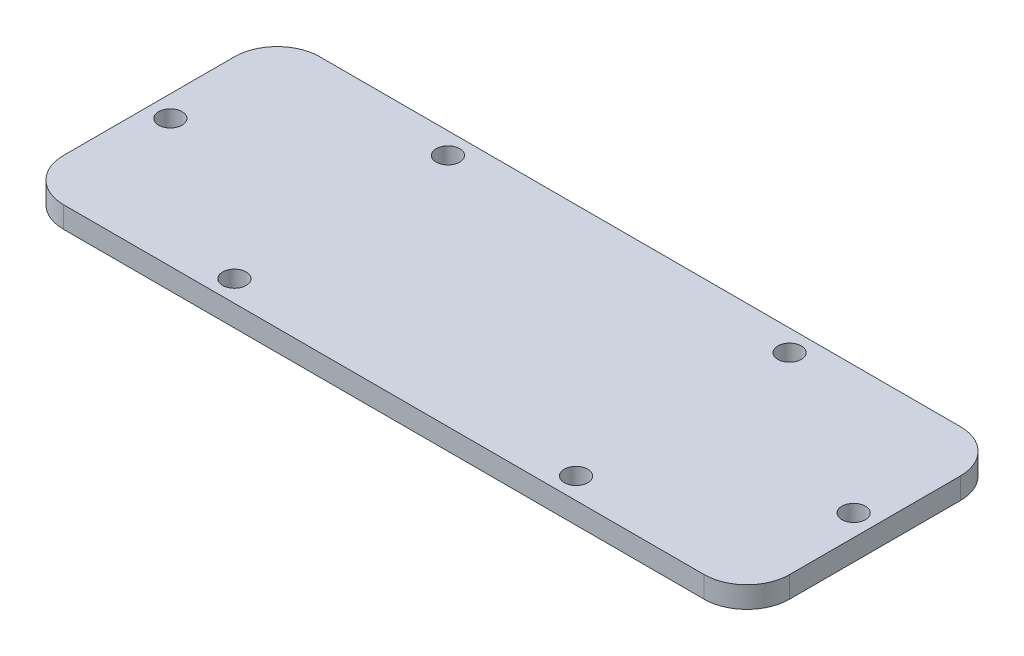
ISO-10303-21;
HEADER;
FILE_DESCRIPTION(('STEP AP214'),'2;1');
FILE_NAME('part.step','',(''),(''),'','','');
FILE_SCHEMA(('AUTOMOTIVE_DESIGN { 1 0 10303 214 1 1 1 1 }'));
ENDSEC;
DATA;
#1=APPLICATION_CONTEXT('core data for automotive mechanical design processes');
#2=APPLICATION_PROTOCOL_DEFINITION('international standard','automotive_design',2000,#1);
#3=PRODUCT_CONTEXT('',#1,'mechanical');
#4=PRODUCT('Part','Part','',(#3));
#5=PRODUCT_RELATED_PRODUCT_CATEGORY('part','',(#4));
#6=PRODUCT_DEFINITION_FORMATION('','',#4);
#7=PRODUCT_DEFINITION_CONTEXT('part definition',#1,'design');
#8=PRODUCT_DEFINITION('design','',#6,#7);
#9=PRODUCT_DEFINITION_SHAPE('','',#8);
#10=(LENGTH_UNIT() NAMED_UNIT(*) SI_UNIT(.MILLI.,.METRE.));
#11=(NAMED_UNIT(*) PLANE_ANGLE_UNIT() SI_UNIT($,.RADIAN.));
#12=(NAMED_UNIT(*) SI_UNIT($,.STERADIAN.) SOLID_ANGLE_UNIT());
#13=UNCERTAINTY_MEASURE_WITH_UNIT(LENGTH_MEASURE(1.E-05),#10,'distance_accuracy_value','');
#14=(GEOMETRIC_REPRESENTATION_CONTEXT(3) GLOBAL_UNCERTAINTY_ASSIGNED_CONTEXT((#13)) GLOBAL_UNIT_ASSIGNED_CONTEXT((#10,
#11,#12)) REPRESENTATION_CONTEXT('',''));
#15=CARTESIAN_POINT('',(0.,0.,0.));
#16=DIRECTION('',(0.,0.,1.));
#17=DIRECTION('',(1.,0.,0.));
#18=AXIS2_PLACEMENT_3D('',#15,#16,#17);
#19=CARTESIAN_POINT('',(160.,5.,-10.));
#20=DIRECTION('',(0.,-1.,0.));
#21=DIRECTION('',(0.,0.,-1.));
#22=AXIS2_PLACEMENT_3D('',#19,#20,#21);
#23=CYLINDRICAL_SURFACE('',#22,10.);
#24=CARTESIAN_POINT('',(160.,0.,-10.));
#25=DIRECTION('',(0.,1.,0.));
#26=DIRECTION('',(0.,0.,1.));
#27=AXIS2_PLACEMENT_3D('',#24,#25,#26);
#28=CIRCLE('',#27,10.);
#29=CARTESIAN_POINT('',(160.,0.,0.));
#30=VERTEX_POINT('',#29);
#31=CARTESIAN_POINT('',(170.,0.,-10.0000000000001));
#32=VERTEX_POINT('',#31);
#33=EDGE_CURVE('E140',#30,#32,#28,.T.);
#34=ORIENTED_EDGE('',*,*,#33,.T.);
#35=DIRECTION('',(0.,-1.,0.));
#36=VECTOR('',#35,1.);
#37=CARTESIAN_POINT('',(170.,5.,-10.0000000000001));
#38=LINE('',#37,#36);
#39=CARTESIAN_POINT('',(170.,5.,-10.0000000000001));
#40=VERTEX_POINT('',#39);
#41=EDGE_CURVE('E11',#40,#32,#38,.T.);
#42=ORIENTED_EDGE('',*,*,#41,.F.);
#43=CARTESIAN_POINT('',(160.,5.,-10.));
#44=DIRECTION('',(0.,1.,0.));
#45=DIRECTION('',(0.,0.,1.));
#46=AXIS2_PLACEMENT_3D('',#43,#44,#45);
#47=CIRCLE('',#46,10.);
#48=CARTESIAN_POINT('',(160.,5.,0.));
#49=VERTEX_POINT('',#48);
#50=EDGE_CURVE('E163',#49,#40,#47,.T.);
#51=ORIENTED_EDGE('',*,*,#50,.F.);
#52=DIRECTION('',(0.,-1.,0.));
#53=VECTOR('',#52,1.);
#54=CARTESIAN_POINT('',(160.,5.,0.));
#55=LINE('',#54,#53);
#56=EDGE_CURVE('E136',#49,#30,#55,.T.);
#57=ORIENTED_EDGE('',*,*,#56,.T.);
#58=EDGE_LOOP('',(#34,#42,#51,#57));
#59=FACE_BOUND('',#58,.T.);
#60=ADVANCED_FACE('F39',(#59),#23,.T.);
#61=CARTESIAN_POINT('',(170.,5.,-10.0000000000001));
#62=DIRECTION('',(-1.,0.,0.));
#63=DIRECTION('',(0.,0.,1.));
#64=AXIS2_PLACEMENT_3D('',#61,#62,#63);
#65=PLANE('',#64);
#66=DIRECTION('',(0.,0.,-1.));
#67=VECTOR('',#66,1.);
#68=CARTESIAN_POINT('',(170.,0.,-10.0000000000001));
#69=LINE('',#68,#67);
#70=CARTESIAN_POINT('',(170.,0.,-49.9999999999999));
#71=VERTEX_POINT('',#70);
#72=EDGE_CURVE('E144',#32,#71,#69,.T.);
#73=ORIENTED_EDGE('',*,*,#72,.T.);
#74=DIRECTION('',(0.,-1.,0.));
#75=VECTOR('',#74,1.);
#76=CARTESIAN_POINT('',(170.,5.,-49.9999999999999));
#77=LINE('',#76,#75);
#78=CARTESIAN_POINT('',(170.,5.,-49.9999999999999));
#79=VERTEX_POINT('',#78);
#80=EDGE_CURVE('E48',#79,#71,#77,.T.);
#81=ORIENTED_EDGE('',*,*,#80,.F.);
#82=DIRECTION('',(0.,0.,-1.));
#83=VECTOR('',#82,1.);
#84=CARTESIAN_POINT('',(170.,5.,-10.0000000000001));
#85=LINE('',#84,#83);
#86=EDGE_CURVE('E99',#40,#79,#85,.T.);
#87=ORIENTED_EDGE('',*,*,#86,.F.);
#88=ORIENTED_EDGE('',*,*,#41,.T.);
#89=EDGE_LOOP('',(#73,#81,#87,#88));
#90=FACE_BOUND('',#89,.T.);
#91=ADVANCED_FACE('F283',(#90),#65,.F.);
#92=CARTESIAN_POINT('',(160.,5.,-50.));
#93=DIRECTION('',(0.,-1.,0.));
#94=DIRECTION('',(0.,0.,-1.));
#95=AXIS2_PLACEMENT_3D('',#92,#93,#94);
#96=CYLINDRICAL_SURFACE('',#95,10.);
#97=CARTESIAN_POINT('',(160.,0.,-50.));
#98=DIRECTION('',(0.,1.,0.));
#99=DIRECTION('',(0.,0.,-1.));
#100=AXIS2_PLACEMENT_3D('',#97,#98,#99);
#101=CIRCLE('',#100,10.);
#102=CARTESIAN_POINT('',(160.,0.,-60.));
#103=VERTEX_POINT('',#102);
#104=EDGE_CURVE('E148',#71,#103,#101,.T.);
#105=ORIENTED_EDGE('',*,*,#104,.T.);
#106=DIRECTION('',(0.,-1.,0.));
#107=VECTOR('',#106,1.);
#108=CARTESIAN_POINT('',(160.,5.,-60.));
#109=LINE('',#108,#107);
#110=CARTESIAN_POINT('',(160.,5.,-60.));
#111=VERTEX_POINT('',#110);
#112=EDGE_CURVE('E174',#111,#103,#109,.T.);
#113=ORIENTED_EDGE('',*,*,#112,.F.);
#114=CARTESIAN_POINT('',(160.,5.,-50.));
#115=DIRECTION('',(0.,1.,0.));
#116=DIRECTION('',(0.,0.,-1.));
#117=AXIS2_PLACEMENT_3D('',#114,#115,#116);
#118=CIRCLE('',#117,10.);
#119=EDGE_CURVE('E184',#79,#111,#118,.T.);
#120=ORIENTED_EDGE('',*,*,#119,.F.);
#121=ORIENTED_EDGE('',*,*,#80,.T.);
#122=EDGE_LOOP('',(#105,#113,#120,#121));
#123=FACE_BOUND('',#122,.T.);
#124=ADVANCED_FACE('F182',(#123),#96,.T.);
#125=CARTESIAN_POINT('',(10.0000000000001,5.,-60.));
#126=DIRECTION('',(0.,0.,1.));
#127=DIRECTION('',(1.,0.,0.));
#128=AXIS2_PLACEMENT_3D('',#125,#126,#127);
#129=PLANE('',#128);
#130=DIRECTION('',(-1.,0.,0.));
#131=VECTOR('',#130,1.);
#132=CARTESIAN_POINT('',(10.0000000000001,0.,-60.));
#133=LINE('',#132,#131);
#134=CARTESIAN_POINT('',(10.,0.,-60.));
#135=VERTEX_POINT('',#134);
#136=EDGE_CURVE('E151',#103,#135,#133,.T.);
#137=ORIENTED_EDGE('',*,*,#136,.T.);
#138=DIRECTION('',(0.,-1.,0.));
#139=VECTOR('',#138,1.);
#140=CARTESIAN_POINT('',(10.,5.,-60.));
#141=LINE('',#140,#139);
#142=CARTESIAN_POINT('',(10.,5.,-60.));
#143=VERTEX_POINT('',#142);
#144=EDGE_CURVE('E170',#143,#135,#141,.T.);
#145=ORIENTED_EDGE('',*,*,#144,.F.);
#146=DIRECTION('',(-1.,0.,0.));
#147=VECTOR('',#146,1.);
#148=CARTESIAN_POINT('',(10.0000000000001,5.,-60.));
#149=LINE('',#148,#147);
#150=EDGE_CURVE('E197',#111,#143,#149,.T.);
#151=ORIENTED_EDGE('',*,*,#150,.F.);
#152=ORIENTED_EDGE('',*,*,#112,.T.);
#153=EDGE_LOOP('',(#137,#145,#151,#152));
#154=FACE_BOUND('',#153,.T.);
#155=ADVANCED_FACE('F192',(#154),#129,.F.);
#156=CARTESIAN_POINT('',(10.,5.,-50.));
#157=DIRECTION('',(0.,-1.,0.));
#158=DIRECTION('',(0.,0.,-1.));
#159=AXIS2_PLACEMENT_3D('',#156,#157,#158);
#160=CYLINDRICAL_SURFACE('',#159,10.);
#161=CARTESIAN_POINT('',(10.,0.,-50.));
#162=DIRECTION('',(0.,1.,0.));
#163=DIRECTION('',(0.,0.,-1.));
#164=AXIS2_PLACEMENT_3D('',#161,#162,#163);
#165=CIRCLE('',#164,10.);
#166=CARTESIAN_POINT('',(0.,0.,-49.9999999999999));
#167=VERTEX_POINT('',#166);
#168=EDGE_CURVE('E154',#135,#167,#165,.T.);
#169=ORIENTED_EDGE('',*,*,#168,.T.);
#170=DIRECTION('',(0.,-1.,0.));
#171=VECTOR('',#170,1.);
#172=CARTESIAN_POINT('',(0.,5.,-49.9999999999999));
#173=LINE('',#172,#171);
#174=CARTESIAN_POINT('',(0.,5.,-49.9999999999999));
#175=VERTEX_POINT('',#174);
#176=EDGE_CURVE('E129',#175,#167,#173,.T.);
#177=ORIENTED_EDGE('',*,*,#176,.F.);
#178=CARTESIAN_POINT('',(10.,5.,-50.));
#179=DIRECTION('',(0.,1.,0.));
#180=DIRECTION('',(0.,0.,-1.));
#181=AXIS2_PLACEMENT_3D('',#178,#179,#180);
#182=CIRCLE('',#181,10.);
#183=EDGE_CURVE('E118',#143,#175,#182,.T.);
#184=ORIENTED_EDGE('',*,*,#183,.F.);
#185=ORIENTED_EDGE('',*,*,#144,.T.);
#186=EDGE_LOOP('',(#169,#177,#184,#185));
#187=FACE_BOUND('',#186,.T.);
#188=ADVANCED_FACE('F195',(#187),#160,.T.);
#189=CARTESIAN_POINT('',(0.,5.,-10.0000000000001));
#190=DIRECTION('',(1.,0.,0.));
#191=DIRECTION('',(0.,0.,-1.));
#192=AXIS2_PLACEMENT_3D('',#189,#190,#191);
#193=PLANE('',#192);
#194=DIRECTION('',(0.,0.,1.));
#195=VECTOR('',#194,1.);
#196=CARTESIAN_POINT('',(0.,0.,-10.0000000000001));
#197=LINE('',#196,#195);
#198=CARTESIAN_POINT('',(0.,0.,-10.0000000000001));
#199=VERTEX_POINT('',#198);
#200=EDGE_CURVE('E127',#167,#199,#197,.T.);
#201=ORIENTED_EDGE('',*,*,#200,.T.);
#202=DIRECTION('',(0.,-1.,0.));
#203=VECTOR('',#202,1.);
#204=CARTESIAN_POINT('',(0.,5.,-10.0000000000001));
#205=LINE('',#204,#203);
#206=CARTESIAN_POINT('',(0.,5.,-10.0000000000001));
#207=VERTEX_POINT('',#206);
#208=EDGE_CURVE('E124',#207,#199,#205,.T.);
#209=ORIENTED_EDGE('',*,*,#208,.F.);
#210=DIRECTION('',(0.,0.,1.));
#211=VECTOR('',#210,1.);
#212=CARTESIAN_POINT('',(0.,5.,-10.0000000000001));
#213=LINE('',#212,#211);
#214=EDGE_CURVE('E112',#175,#207,#213,.T.);
#215=ORIENTED_EDGE('',*,*,#214,.F.);
#216=ORIENTED_EDGE('',*,*,#176,.T.);
#217=EDGE_LOOP('',(#201,#209,#215,#216));
#218=FACE_BOUND('',#217,.T.);
#219=ADVANCED_FACE('F125',(#218),#193,.F.);
#220=CARTESIAN_POINT('',(10.,5.,-10.));
#221=DIRECTION('',(0.,-1.,0.));
#222=DIRECTION('',(0.,0.,-1.));
#223=AXIS2_PLACEMENT_3D('',#220,#221,#222);
#224=CYLINDRICAL_SURFACE('',#223,10.);
#225=CARTESIAN_POINT('',(10.,0.,-10.));
#226=DIRECTION('',(0.,1.,0.));
#227=DIRECTION('',(0.,0.,-1.));
#228=AXIS2_PLACEMENT_3D('',#225,#226,#227);
#229=CIRCLE('',#228,10.);
#230=CARTESIAN_POINT('',(10.0000000000001,0.,0.));
#231=VERTEX_POINT('',#230);
#232=EDGE_CURVE('E85',#199,#231,#229,.T.);
#233=ORIENTED_EDGE('',*,*,#232,.T.);
#234=DIRECTION('',(0.,-1.,0.));
#235=VECTOR('',#234,1.);
#236=CARTESIAN_POINT('',(10.0000000000001,5.,0.));
#237=LINE('',#236,#235);
#238=CARTESIAN_POINT('',(10.0000000000001,5.,0.));
#239=VERTEX_POINT('',#238);
#240=EDGE_CURVE('E130',#239,#231,#237,.T.);
#241=ORIENTED_EDGE('',*,*,#240,.F.);
#242=CARTESIAN_POINT('',(10.,5.,-10.));
#243=DIRECTION('',(0.,1.,0.));
#244=DIRECTION('',(0.,0.,-1.));
#245=AXIS2_PLACEMENT_3D('',#242,#243,#244);
#246=CIRCLE('',#245,10.);
#247=EDGE_CURVE('E116',#207,#239,#246,.T.);
#248=ORIENTED_EDGE('',*,*,#247,.F.);
#249=ORIENTED_EDGE('',*,*,#208,.T.);
#250=EDGE_LOOP('',(#233,#241,#248,#249));
#251=FACE_BOUND('',#250,.T.);
#252=ADVANCED_FACE('F132',(#251),#224,.T.);
#253=CARTESIAN_POINT('',(10.0000000000001,5.,0.));
#254=DIRECTION('',(0.,0.,-1.));
#255=DIRECTION('',(-1.,0.,0.));
#256=AXIS2_PLACEMENT_3D('',#253,#254,#255);
#257=PLANE('',#256);
#258=DIRECTION('',(1.,0.,0.));
#259=VECTOR('',#258,1.);
#260=CARTESIAN_POINT('',(10.0000000000001,0.,0.));
#261=LINE('',#260,#259);
#262=EDGE_CURVE('E91',#231,#30,#261,.T.);
#263=ORIENTED_EDGE('',*,*,#262,.T.);
#264=ORIENTED_EDGE('',*,*,#56,.F.);
#265=DIRECTION('',(1.,0.,0.));
#266=VECTOR('',#265,1.);
#267=CARTESIAN_POINT('',(10.0000000000001,5.,0.));
#268=LINE('',#267,#266);
#269=EDGE_CURVE('E56',#239,#49,#268,.T.);
#270=ORIENTED_EDGE('',*,*,#269,.F.);
#271=ORIENTED_EDGE('',*,*,#240,.T.);
#272=EDGE_LOOP('',(#263,#264,#270,#271));
#273=FACE_BOUND('',#272,.T.);
#274=ADVANCED_FACE('F267',(#273),#257,.F.);
#275=CARTESIAN_POINT('',(160.,5.,-10.));
#276=DIRECTION('',(0.,1.,0.));
#277=DIRECTION('',(0.,0.,1.));
#278=AXIS2_PLACEMENT_3D('',#275,#276,#277);
#279=PLANE('',#278);
#280=CARTESIAN_POINT('',(5.,5.,-30.));
#281=DIRECTION('',(0.,1.,0.));
#282=DIRECTION('',(0.,0.,1.));
#283=AXIS2_PLACEMENT_3D('',#280,#281,#282);
#284=CIRCLE('',#283,2.75);
#285=CARTESIAN_POINT('',(5.,5.,-27.25));
#286=VERTEX_POINT('',#285);
#287=EDGE_CURVE('E215',#286,#286,#284,.T.);
#288=ORIENTED_EDGE('',*,*,#287,.F.);
#289=EDGE_LOOP('',(#288));
#290=FACE_BOUND('',#289,.T.);
#291=CARTESIAN_POINT('',(45.,5.,-5.));
#292=DIRECTION('',(0.,1.,0.));
#293=DIRECTION('',(0.,0.,1.));
#294=AXIS2_PLACEMENT_3D('',#291,#292,#293);
#295=CIRCLE('',#294,2.74999999999999);
#296=CARTESIAN_POINT('',(45.,5.,-2.25000000000001));
#297=VERTEX_POINT('',#296);
#298=EDGE_CURVE('E223',#297,#297,#295,.T.);
#299=ORIENTED_EDGE('',*,*,#298,.F.);
#300=EDGE_LOOP('',(#299));
#301=FACE_BOUND('',#300,.T.);
#302=CARTESIAN_POINT('',(125.,5.,-5.));
#303=DIRECTION('',(0.,1.,0.));
#304=DIRECTION('',(0.,0.,1.));
#305=AXIS2_PLACEMENT_3D('',#302,#303,#304);
#306=CIRCLE('',#305,2.75000000000001);
#307=CARTESIAN_POINT('',(125.,5.,-2.24999999999999));
#308=VERTEX_POINT('',#307);
#309=EDGE_CURVE('E231',#308,#308,#306,.T.);
#310=ORIENTED_EDGE('',*,*,#309,.F.);
#311=EDGE_LOOP('',(#310));
#312=FACE_BOUND('',#311,.T.);
#313=CARTESIAN_POINT('',(165.,5.,-30.));
#314=DIRECTION('',(0.,1.,0.));
#315=DIRECTION('',(0.,0.,1.));
#316=AXIS2_PLACEMENT_3D('',#313,#314,#315);
#317=CIRCLE('',#316,2.75000000000001);
#318=CARTESIAN_POINT('',(165.,5.,-27.25));
#319=VERTEX_POINT('',#318);
#320=EDGE_CURVE('E239',#319,#319,#317,.T.);
#321=ORIENTED_EDGE('',*,*,#320,.F.);
#322=EDGE_LOOP('',(#321));
#323=FACE_BOUND('',#322,.T.);
#324=CARTESIAN_POINT('',(125.,5.,-55.));
#325=DIRECTION('',(0.,1.,0.));
#326=DIRECTION('',(0.,0.,1.));
#327=AXIS2_PLACEMENT_3D('',#324,#325,#326);
#328=CIRCLE('',#327,2.75000000000001);
#329=CARTESIAN_POINT('',(125.,5.,-52.25));
#330=VERTEX_POINT('',#329);
#331=EDGE_CURVE('E247',#330,#330,#328,.T.);
#332=ORIENTED_EDGE('',*,*,#331,.F.);
#333=EDGE_LOOP('',(#332));
#334=FACE_BOUND('',#333,.T.);
#335=CARTESIAN_POINT('',(45.,5.,-55.));
#336=DIRECTION('',(0.,1.,0.));
#337=DIRECTION('',(0.,0.,1.));
#338=AXIS2_PLACEMENT_3D('',#335,#336,#337);
#339=CIRCLE('',#338,2.75);
#340=CARTESIAN_POINT('',(45.,5.,-52.25));
#341=VERTEX_POINT('',#340);
#342=EDGE_CURVE('E207',#341,#341,#339,.T.);
#343=ORIENTED_EDGE('',*,*,#342,.F.);
#344=EDGE_LOOP('',(#343));
#345=FACE_BOUND('',#344,.T.);
#346=ORIENTED_EDGE('',*,*,#50,.T.);
#347=ORIENTED_EDGE('',*,*,#86,.T.);
#348=ORIENTED_EDGE('',*,*,#119,.T.);
#349=ORIENTED_EDGE('',*,*,#150,.T.);
#350=ORIENTED_EDGE('',*,*,#183,.T.);
#351=ORIENTED_EDGE('',*,*,#214,.T.);
#352=ORIENTED_EDGE('',*,*,#247,.T.);
#353=ORIENTED_EDGE('',*,*,#269,.T.);
#354=EDGE_LOOP('',(#346,#347,#348,#349,#350,#351,#352,#353));
#355=FACE_BOUND('',#354,.T.);
#356=ADVANCED_FACE('F114',(#290,#301,#312,#323,#334,#345,#355),#279,.T.);
#357=CARTESIAN_POINT('',(160.,0.,-10.));
#358=DIRECTION('',(0.,1.,0.));
#359=DIRECTION('',(0.,0.,1.));
#360=AXIS2_PLACEMENT_3D('',#357,#358,#359);
#361=PLANE('',#360);
#362=CARTESIAN_POINT('',(5.,0.,-30.));
#363=DIRECTION('',(0.,1.,0.));
#364=DIRECTION('',(0.,0.,1.));
#365=AXIS2_PLACEMENT_3D('',#362,#363,#364);
#366=CIRCLE('',#365,2.75);
#367=CARTESIAN_POINT('',(5.,0.,-27.25));
#368=VERTEX_POINT('',#367);
#369=EDGE_CURVE('E219',#368,#368,#366,.T.);
#370=ORIENTED_EDGE('',*,*,#369,.T.);
#371=EDGE_LOOP('',(#370));
#372=FACE_BOUND('',#371,.T.);
#373=CARTESIAN_POINT('',(45.,0.,-5.));
#374=DIRECTION('',(0.,1.,0.));
#375=DIRECTION('',(0.,0.,1.));
#376=AXIS2_PLACEMENT_3D('',#373,#374,#375);
#377=CIRCLE('',#376,2.74999999999999);
#378=CARTESIAN_POINT('',(45.,0.,-2.25000000000001));
#379=VERTEX_POINT('',#378);
#380=EDGE_CURVE('E227',#379,#379,#377,.T.);
#381=ORIENTED_EDGE('',*,*,#380,.T.);
#382=EDGE_LOOP('',(#381));
#383=FACE_BOUND('',#382,.T.);
#384=CARTESIAN_POINT('',(125.,0.,-5.));
#385=DIRECTION('',(0.,1.,0.));
#386=DIRECTION('',(0.,0.,1.));
#387=AXIS2_PLACEMENT_3D('',#384,#385,#386);
#388=CIRCLE('',#387,2.75000000000001);
#389=CARTESIAN_POINT('',(125.,0.,-2.24999999999999));
#390=VERTEX_POINT('',#389);
#391=EDGE_CURVE('E235',#390,#390,#388,.T.);
#392=ORIENTED_EDGE('',*,*,#391,.T.);
#393=EDGE_LOOP('',(#392));
#394=FACE_BOUND('',#393,.T.);
#395=CARTESIAN_POINT('',(165.,0.,-30.));
#396=DIRECTION('',(0.,1.,0.));
#397=DIRECTION('',(0.,0.,1.));
#398=AXIS2_PLACEMENT_3D('',#395,#396,#397);
#399=CIRCLE('',#398,2.75000000000001);
#400=CARTESIAN_POINT('',(165.,0.,-27.25));
#401=VERTEX_POINT('',#400);
#402=EDGE_CURVE('E243',#401,#401,#399,.T.);
#403=ORIENTED_EDGE('',*,*,#402,.T.);
#404=EDGE_LOOP('',(#403));
#405=FACE_BOUND('',#404,.T.);
#406=CARTESIAN_POINT('',(125.,0.,-55.));
#407=DIRECTION('',(0.,1.,0.));
#408=DIRECTION('',(0.,0.,1.));
#409=AXIS2_PLACEMENT_3D('',#406,#407,#408);
#410=CIRCLE('',#409,2.75000000000001);
#411=CARTESIAN_POINT('',(125.,0.,-52.25));
#412=VERTEX_POINT('',#411);
#413=EDGE_CURVE('E211',#412,#412,#410,.T.);
#414=ORIENTED_EDGE('',*,*,#413,.T.);
#415=EDGE_LOOP('',(#414));
#416=FACE_BOUND('',#415,.T.);
#417=CARTESIAN_POINT('',(45.,0.,-55.));
#418=DIRECTION('',(0.,1.,0.));
#419=DIRECTION('',(0.,0.,1.));
#420=AXIS2_PLACEMENT_3D('',#417,#418,#419);
#421=CIRCLE('',#420,2.75);
#422=CARTESIAN_POINT('',(45.,0.,-52.25));
#423=VERTEX_POINT('',#422);
#424=EDGE_CURVE('E145',#423,#423,#421,.T.);
#425=ORIENTED_EDGE('',*,*,#424,.T.);
#426=EDGE_LOOP('',(#425));
#427=FACE_BOUND('',#426,.T.);
#428=ORIENTED_EDGE('',*,*,#33,.F.);
#429=ORIENTED_EDGE('',*,*,#262,.F.);
#430=ORIENTED_EDGE('',*,*,#232,.F.);
#431=ORIENTED_EDGE('',*,*,#200,.F.);
#432=ORIENTED_EDGE('',*,*,#168,.F.);
#433=ORIENTED_EDGE('',*,*,#136,.F.);
#434=ORIENTED_EDGE('',*,*,#104,.F.);
#435=ORIENTED_EDGE('',*,*,#72,.F.);
#436=EDGE_LOOP('',(#428,#429,#430,#431,#432,#433,#434,#435));
#437=FACE_BOUND('',#436,.T.);
#438=ADVANCED_FACE('F188',(#372,#383,#394,#405,#416,#427,#437),#361,.F.);
#439=CARTESIAN_POINT('',(45.,0.,-55.));
#440=DIRECTION('',(0.,1.,0.));
#441=DIRECTION('',(0.,0.,1.));
#442=AXIS2_PLACEMENT_3D('',#439,#440,#441);
#443=CYLINDRICAL_SURFACE('',#442,2.75);
#444=ORIENTED_EDGE('',*,*,#424,.F.);
#445=EDGE_LOOP('',(#444));
#446=FACE_BOUND('',#445,.T.);
#447=ORIENTED_EDGE('',*,*,#342,.T.);
#448=EDGE_LOOP('',(#447));
#449=FACE_BOUND('',#448,.T.);
#450=ADVANCED_FACE('F261',(#446,#449),#443,.F.);
#451=CARTESIAN_POINT('',(125.,0.,-55.));
#452=DIRECTION('',(0.,1.,0.));
#453=DIRECTION('',(0.,0.,1.));
#454=AXIS2_PLACEMENT_3D('',#451,#452,#453);
#455=CYLINDRICAL_SURFACE('',#454,2.75000000000001);
#456=ORIENTED_EDGE('',*,*,#413,.F.);
#457=EDGE_LOOP('',(#456));
#458=FACE_BOUND('',#457,.T.);
#459=ORIENTED_EDGE('',*,*,#331,.T.);
#460=EDGE_LOOP('',(#459));
#461=FACE_BOUND('',#460,.T.);
#462=ADVANCED_FACE('F257',(#458,#461),#455,.F.);
#463=CARTESIAN_POINT('',(165.,0.,-30.));
#464=DIRECTION('',(0.,1.,0.));
#465=DIRECTION('',(0.,0.,1.));
#466=AXIS2_PLACEMENT_3D('',#463,#464,#465);
#467=CYLINDRICAL_SURFACE('',#466,2.75000000000001);
#468=ORIENTED_EDGE('',*,*,#402,.F.);
#469=EDGE_LOOP('',(#468));
#470=FACE_BOUND('',#469,.T.);
#471=ORIENTED_EDGE('',*,*,#320,.T.);
#472=EDGE_LOOP('',(#471));
#473=FACE_BOUND('',#472,.T.);
#474=ADVANCED_FACE('F260',(#470,#473),#467,.F.);
#475=CARTESIAN_POINT('',(125.,0.,-5.));
#476=DIRECTION('',(0.,1.,0.));
#477=DIRECTION('',(0.,0.,1.));
#478=AXIS2_PLACEMENT_3D('',#475,#476,#477);
#479=CYLINDRICAL_SURFACE('',#478,2.75000000000001);
#480=ORIENTED_EDGE('',*,*,#391,.F.);
#481=EDGE_LOOP('',(#480));
#482=FACE_BOUND('',#481,.T.);
#483=ORIENTED_EDGE('',*,*,#309,.T.);
#484=EDGE_LOOP('',(#483));
#485=FACE_BOUND('',#484,.T.);
#486=ADVANCED_FACE('F359',(#482,#485),#479,.F.);
#487=CARTESIAN_POINT('',(45.,0.,-5.));
#488=DIRECTION('',(0.,1.,0.));
#489=DIRECTION('',(0.,0.,1.));
#490=AXIS2_PLACEMENT_3D('',#487,#488,#489);
#491=CYLINDRICAL_SURFACE('',#490,2.74999999999999);
#492=ORIENTED_EDGE('',*,*,#380,.F.);
#493=EDGE_LOOP('',(#492));
#494=FACE_BOUND('',#493,.T.);
#495=ORIENTED_EDGE('',*,*,#298,.T.);
#496=EDGE_LOOP('',(#495));
#497=FACE_BOUND('',#496,.T.);
#498=ADVANCED_FACE('F369',(#494,#497),#491,.F.);
#499=CARTESIAN_POINT('',(5.,0.,-30.));
#500=DIRECTION('',(0.,1.,0.));
#501=DIRECTION('',(0.,0.,1.));
#502=AXIS2_PLACEMENT_3D('',#499,#500,#501);
#503=CYLINDRICAL_SURFACE('',#502,2.75);
#504=ORIENTED_EDGE('',*,*,#369,.F.);
#505=EDGE_LOOP('',(#504));
#506=FACE_BOUND('',#505,.T.);
#507=ORIENTED_EDGE('',*,*,#287,.T.);
#508=EDGE_LOOP('',(#507));
#509=FACE_BOUND('',#508,.T.);
#510=ADVANCED_FACE('F379',(#506,#509),#503,.F.);
#511=CLOSED_SHELL('',(#60,#91,#124,#155,#188,#219,#252,#274,#356,#438,#450,#462,#474,#486,#498,#510));
#512=MANIFOLD_SOLID_BREP('B2',#511);
#513=ADVANCED_BREP_SHAPE_REPRESENTATION('',(#18,#512),#14);
#514=SHAPE_DEFINITION_REPRESENTATION(#9,#513);
ENDSEC;
END-ISO-10303-21;
